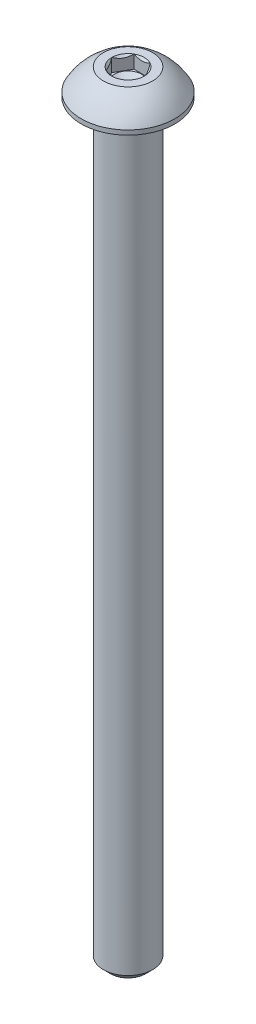
ISO-10303-21;
HEADER;
FILE_DESCRIPTION(('STEP AP214'),'2;1');
FILE_NAME('part.step','',(''),(''),'','','');
FILE_SCHEMA(('AUTOMOTIVE_DESIGN { 1 0 10303 214 1 1 1 1 }'));
ENDSEC;
DATA;
#1=APPLICATION_CONTEXT('core data for automotive mechanical design processes');
#2=APPLICATION_PROTOCOL_DEFINITION('international standard','automotive_design',2000,#1);
#3=PRODUCT_CONTEXT('',#1,'mechanical');
#4=PRODUCT('Part','Part','',(#3));
#5=PRODUCT_RELATED_PRODUCT_CATEGORY('part','',(#4));
#6=PRODUCT_DEFINITION_FORMATION('','',#4);
#7=PRODUCT_DEFINITION_CONTEXT('part definition',#1,'design');
#8=PRODUCT_DEFINITION('design','',#6,#7);
#9=PRODUCT_DEFINITION_SHAPE('','',#8);
#10=(LENGTH_UNIT() NAMED_UNIT(*) SI_UNIT(.MILLI.,.METRE.));
#11=(NAMED_UNIT(*) PLANE_ANGLE_UNIT() SI_UNIT($,.RADIAN.));
#12=(NAMED_UNIT(*) SI_UNIT($,.STERADIAN.) SOLID_ANGLE_UNIT());
#13=UNCERTAINTY_MEASURE_WITH_UNIT(LENGTH_MEASURE(1.E-05),#10,'distance_accuracy_value','');
#14=(GEOMETRIC_REPRESENTATION_CONTEXT(3) GLOBAL_UNCERTAINTY_ASSIGNED_CONTEXT((#13)) GLOBAL_UNIT_ASSIGNED_CONTEXT((#10,
#11,#12)) REPRESENTATION_CONTEXT('',''));
#15=CARTESIAN_POINT('',(0.,0.,0.));
#16=DIRECTION('',(0.,0.,1.));
#17=DIRECTION('',(1.,0.,0.));
#18=AXIS2_PLACEMENT_3D('',#15,#16,#17);
#19=CARTESIAN_POINT('',(0.,0.,0.));
#20=DIRECTION('',(0.,1.,0.));
#21=DIRECTION('',(0.,0.,1.));
#22=AXIS2_PLACEMENT_3D('',#19,#20,#21);
#23=PLANE('',#22);
#24=CARTESIAN_POINT('',(0.,0.,0.));
#25=DIRECTION('',(0.,-1.,0.));
#26=DIRECTION('',(-1.,0.,0.));
#27=AXIS2_PLACEMENT_3D('',#24,#25,#26);
#28=CIRCLE('',#27,1.4859);
#29=CARTESIAN_POINT('',(-1.4859,0.,0.));
#30=VERTEX_POINT('',#29);
#31=EDGE_CURVE('E184',#30,#30,#28,.T.);
#32=ORIENTED_EDGE('',*,*,#31,.T.);
#33=EDGE_LOOP('',(#32));
#34=FACE_BOUND('',#33,.T.);
#35=ADVANCED_FACE('F16',(#34),#23,.F.);
#36=CARTESIAN_POINT('',(0.,0.,0.));
#37=DIRECTION('',(0.,-1.,0.));
#38=DIRECTION('',(-1.,0.,0.));
#39=AXIS2_PLACEMENT_3D('',#36,#37,#38);
#40=CYLINDRICAL_SURFACE('',#39,2.0828);
#41=CARTESIAN_POINT('',(0.,63.5,0.));
#42=DIRECTION('',(0.,1.,0.));
#43=DIRECTION('',(-1.,0.,0.));
#44=AXIS2_PLACEMENT_3D('',#41,#42,#43);
#45=CIRCLE('',#44,2.0828);
#46=CARTESIAN_POINT('',(-2.0828,63.5,0.));
#47=VERTEX_POINT('',#46);
#48=EDGE_CURVE('E176',#47,#47,#45,.T.);
#49=ORIENTED_EDGE('',*,*,#48,.F.);
#50=EDGE_LOOP('',(#49));
#51=FACE_BOUND('',#50,.T.);
#52=CARTESIAN_POINT('',(0.,0.5969,0.));
#53=DIRECTION('',(0.,1.,0.));
#54=DIRECTION('',(-1.,0.,0.));
#55=AXIS2_PLACEMENT_3D('',#52,#53,#54);
#56=CIRCLE('',#55,2.0828);
#57=CARTESIAN_POINT('',(2.0828,0.5969,0.));
#58=VERTEX_POINT('',#57);
#59=EDGE_CURVE('E182',#58,#58,#56,.T.);
#60=ORIENTED_EDGE('',*,*,#59,.T.);
#61=EDGE_LOOP('',(#60));
#62=FACE_BOUND('',#61,.T.);
#63=ADVANCED_FACE('F509',(#51,#62),#40,.T.);
#64=CARTESIAN_POINT('',(0.,63.6905,0.));
#65=DIRECTION('',(0.,1.,0.));
#66=DIRECTION('',(0.,0.,-1.));
#67=AXIS2_PLACEMENT_3D('',#64,#65,#66);
#68=CYLINDRICAL_SURFACE('',#67,3.9624);
#69=CARTESIAN_POINT('',(0.,63.5,0.));
#70=DIRECTION('',(0.,-1.,0.));
#71=DIRECTION('',(1.,0.,0.));
#72=AXIS2_PLACEMENT_3D('',#69,#70,#71);
#73=CIRCLE('',#72,3.9624);
#74=CARTESIAN_POINT('',(0.,63.5,-3.9624));
#75=VERTEX_POINT('',#74);
#76=EDGE_CURVE('E96',#75,#75,#73,.T.);
#77=ORIENTED_EDGE('',*,*,#76,.F.);
#78=EDGE_LOOP('',(#77));
#79=FACE_BOUND('',#78,.T.);
#80=CARTESIAN_POINT('',(0.,63.881,0.));
#81=DIRECTION('',(0.,-1.,0.));
#82=DIRECTION('',(1.,0.,0.));
#83=AXIS2_PLACEMENT_3D('',#80,#81,#82);
#84=CIRCLE('',#83,3.9624);
#85=CARTESIAN_POINT('',(0.,63.881,-3.9624));
#86=VERTEX_POINT('',#85);
#87=EDGE_CURVE('E11',#86,#86,#84,.T.);
#88=ORIENTED_EDGE('',*,*,#87,.T.);
#89=EDGE_LOOP('',(#88));
#90=FACE_BOUND('',#89,.T.);
#91=ADVANCED_FACE('F319',(#79,#90),#68,.T.);
#92=CARTESIAN_POINT('',(0.,61.6888388888889,0.));
#93=DIRECTION('',(0.,0.,1.));
#94=DIRECTION('',(1.,0.,0.));
#95=AXIS2_PLACEMENT_3D('',#92,#93,#94);
#96=SPHERICAL_SURFACE('',#95,4.52837543685016);
#97=CARTESIAN_POINT('',(0.,61.6888388888889,0.));
#98=DIRECTION('',(0.,-1.,0.));
#99=DIRECTION('',(1.,0.,0.));
#100=AXIS2_PLACEMENT_3D('',#97,#98,#99);
#101=SPHERICAL_SURFACE('',#100,4.52837543685016);
#102=ORIENTED_EDGE('',*,*,#87,.F.);
#103=EDGE_LOOP('',(#102));
#104=FACE_BOUND('',#103,.T.);
#105=CARTESIAN_POINT('',(0.,65.7098,0.));
#106=DIRECTION('',(0.,-1.,0.));
#107=DIRECTION('',(1.,0.,0.));
#108=AXIS2_PLACEMENT_3D('',#105,#106,#107);
#109=CIRCLE('',#108,2.0828);
#110=CARTESIAN_POINT('',(0.,65.7098,-2.0828));
#111=VERTEX_POINT('',#110);
#112=EDGE_CURVE('E180',#111,#111,#109,.T.);
#113=ORIENTED_EDGE('',*,*,#112,.T.);
#114=EDGE_LOOP('',(#113));
#115=FACE_BOUND('',#114,.T.);
#116=ADVANCED_FACE('F312',(#104,#115),#101,.T.);
#117=CARTESIAN_POINT('',(0.,64.4271,0.));
#118=DIRECTION('',(0.,1.,0.));
#119=DIRECTION('',(0.,0.,-1.));
#120=AXIS2_PLACEMENT_3D('',#117,#118,#119);
#121=CONICAL_SURFACE('',#120,0.8763,1.03037682652431);
#122=CARTESIAN_POINT('',(0.,64.2366,0.));
#123=DIRECTION('',(0.,-1.,0.));
#124=DIRECTION('',(1.,0.,0.));
#125=AXIS2_PLACEMENT_3D('',#122,#123,#124);
#126=CIRCLE('',#125,0.5588);
#127=CARTESIAN_POINT('',(0.,64.2366,-0.5588));
#128=VERTEX_POINT('',#127);
#129=EDGE_CURVE('E26',#128,#128,#126,.T.);
#130=ORIENTED_EDGE('',*,*,#129,.T.);
#131=EDGE_LOOP('',(#130));
#132=FACE_BOUND('',#131,.T.);
#133=CARTESIAN_POINT('',(0.,64.5922,0.));
#134=DIRECTION('',(0.,1.,0.));
#135=DIRECTION('',(0.,0.,-1.));
#136=AXIS2_PLACEMENT_3D('',#133,#134,#135);
#137=CIRCLE('',#136,1.15146666666666);
#138=CARTESIAN_POINT('',(0.,64.5922,1.15146666666666));
#139=VERTEX_POINT('',#138);
#140=EDGE_CURVE('E103',#139,#139,#137,.T.);
#141=ORIENTED_EDGE('',*,*,#140,.T.);
#142=EDGE_LOOP('',(#141));
#143=FACE_BOUND('',#142,.T.);
#144=ADVANCED_FACE('F318',(#132,#143),#121,.F.);
#145=CARTESIAN_POINT('',(0.,64.2366,-0.5588));
#146=DIRECTION('',(0.,1.,0.));
#147=DIRECTION('',(0.,0.,1.));
#148=AXIS2_PLACEMENT_3D('',#145,#146,#147);
#149=PLANE('',#148);
#150=ORIENTED_EDGE('',*,*,#129,.F.);
#151=EDGE_LOOP('',(#150));
#152=FACE_BOUND('',#151,.T.);
#153=ADVANCED_FACE('F373',(#152),#149,.T.);
#154=CARTESIAN_POINT('',(0.,63.5,0.));
#155=DIRECTION('',(0.,-1.,0.));
#156=DIRECTION('',(0.,0.,-1.));
#157=AXIS2_PLACEMENT_3D('',#154,#155,#156);
#158=PLANE('',#157);
#159=ORIENTED_EDGE('',*,*,#48,.T.);
#160=EDGE_LOOP('',(#159));
#161=FACE_BOUND('',#160,.T.);
#162=ORIENTED_EDGE('',*,*,#76,.T.);
#163=EDGE_LOOP('',(#162));
#164=FACE_BOUND('',#163,.T.);
#165=ADVANCED_FACE('F368',(#161,#164),#158,.T.);
#166=CARTESIAN_POINT('',(0.,64.5922,0.));
#167=DIRECTION('',(0.,-1.,0.));
#168=DIRECTION('',(0.,0.,-1.));
#169=AXIS2_PLACEMENT_3D('',#166,#167,#168);
#170=PLANE('',#169);
#171=DIRECTION('',(0.5,0.,-0.866025403784439));
#172=VECTOR('',#171,1.);
#173=CARTESIAN_POINT('',(-0.689240751358575,64.5922,-1.1938));
#174=LINE('',#173,#172);
#175=CARTESIAN_POINT('',(-1.37848150271715,64.5922,0.));
#176=VERTEX_POINT('',#175);
#177=CARTESIAN_POINT('',(-0.689240751358575,64.5922,-1.1938));
#178=VERTEX_POINT('',#177);
#179=EDGE_CURVE('E125',#176,#178,#174,.T.);
#180=ORIENTED_EDGE('',*,*,#179,.F.);
#181=DIRECTION('',(-0.5,0.,-0.866025403784439));
#182=VECTOR('',#181,1.);
#183=CARTESIAN_POINT('',(-1.37848150271715,64.5922,0.));
#184=LINE('',#183,#182);
#185=CARTESIAN_POINT('',(-0.689240751358576,64.5922,1.1938));
#186=VERTEX_POINT('',#185);
#187=EDGE_CURVE('E214',#186,#176,#184,.T.);
#188=ORIENTED_EDGE('',*,*,#187,.F.);
#189=DIRECTION('',(-1.,0.,0.));
#190=VECTOR('',#189,1.);
#191=CARTESIAN_POINT('',(-0.689240751358576,64.5922,1.1938));
#192=LINE('',#191,#190);
#193=CARTESIAN_POINT('',(0.689240751358575,64.5922,1.1938));
#194=VERTEX_POINT('',#193);
#195=EDGE_CURVE('E148',#194,#186,#192,.T.);
#196=ORIENTED_EDGE('',*,*,#195,.F.);
#197=DIRECTION('',(-0.5,0.,0.866025403784438));
#198=VECTOR('',#197,1.);
#199=CARTESIAN_POINT('',(0.689240751358574,64.5922,1.1938));
#200=LINE('',#199,#198);
#201=CARTESIAN_POINT('',(1.37848150271715,64.5922,0.));
#202=VERTEX_POINT('',#201);
#203=EDGE_CURVE('E131',#202,#194,#200,.T.);
#204=ORIENTED_EDGE('',*,*,#203,.F.);
#205=DIRECTION('',(0.5,0.,0.866025403784439));
#206=VECTOR('',#205,1.);
#207=CARTESIAN_POINT('',(1.37848150271715,64.5922,0.));
#208=LINE('',#207,#206);
#209=CARTESIAN_POINT('',(0.689240751358575,64.5922,-1.1938));
#210=VERTEX_POINT('',#209);
#211=EDGE_CURVE('E146',#210,#202,#208,.T.);
#212=ORIENTED_EDGE('',*,*,#211,.F.);
#213=DIRECTION('',(1.,0.,0.));
#214=VECTOR('',#213,1.);
#215=CARTESIAN_POINT('',(0.689240751358575,64.5922,-1.1938));
#216=LINE('',#215,#214);
#217=EDGE_CURVE('E257',#178,#210,#216,.T.);
#218=ORIENTED_EDGE('',*,*,#217,.F.);
#219=EDGE_LOOP('',(#180,#188,#196,#204,#212,#218));
#220=FACE_BOUND('',#219,.T.);
#221=ORIENTED_EDGE('',*,*,#140,.F.);
#222=EDGE_LOOP('',(#221));
#223=FACE_BOUND('',#222,.T.);
#224=ADVANCED_FACE('F300',(#220,#223),#170,.F.);
#225=CARTESIAN_POINT('',(-1.37848150271715,65.7098,0.));
#226=DIRECTION('',(-0.866025403784439,0.,-0.5));
#227=DIRECTION('',(0.5,0.,-0.866025403784439));
#228=AXIS2_PLACEMENT_3D('',#225,#226,#227);
#229=PLANE('',#228);
#230=CARTESIAN_POINT('',(-0.696174837710029,65.7098,-1.18178981013521));
#231=CARTESIAN_POINT('',(-1.03386112703786,65.3772481481482,-0.596899999999999));
#232=CARTESIAN_POINT('',(-1.37154741636569,65.7098,-0.0120101898647895));
#233=(BOUNDED_CURVE() B_SPLINE_CURVE(2,(#230,#231,#232),.UNSPECIFIED.,.F.,
.F.) B_SPLINE_CURVE_WITH_KNOTS((3,3),(0.,0.139676907182254),
.UNSPECIFIED.) CURVE() GEOMETRIC_REPRESENTATION_ITEM() RATIONAL_B_SPLINE_CURVE((1.,
1.1489361702128,1.)) REPRESENTATION_ITEM(''));
#234=CARTESIAN_POINT('',(-0.696174837710028,65.7098,-1.18178981013521));
#235=VERTEX_POINT('',#234);
#236=CARTESIAN_POINT('',(-1.37154741636569,65.7098,-0.0120101898647889));
#237=VERTEX_POINT('',#236);
#238=EDGE_CURVE('E195',#235,#237,#233,.T.);
#239=ORIENTED_EDGE('',*,*,#238,.T.);
#240=DIRECTION('',(0.5,0.,-0.866025403784439));
#241=VECTOR('',#240,1.);
#242=CARTESIAN_POINT('',(-0.755231887126948,65.7098,-1.0795));
#243=LINE('',#242,#241);
#244=CARTESIAN_POINT('',(-1.37848150271715,65.7098,0.));
#245=VERTEX_POINT('',#244);
#246=EDGE_CURVE('E193',#245,#237,#243,.T.);
#247=ORIENTED_EDGE('',*,*,#246,.F.);
#248=DIRECTION('',(0.,-1.,0.));
#249=VECTOR('',#248,1.);
#250=CARTESIAN_POINT('',(-1.37848150271715,65.7098,0.));
#251=LINE('',#250,#249);
#252=EDGE_CURVE('E211',#245,#176,#251,.T.);
#253=ORIENTED_EDGE('',*,*,#252,.T.);
#254=ORIENTED_EDGE('',*,*,#179,.T.);
#255=DIRECTION('',(0.,-1.,0.));
#256=VECTOR('',#255,1.);
#257=CARTESIAN_POINT('',(-0.689240751358575,65.7098,-1.1938));
#258=LINE('',#257,#256);
#259=CARTESIAN_POINT('',(-0.689240751358575,65.7098,-1.1938));
#260=VERTEX_POINT('',#259);
#261=EDGE_CURVE('E235',#260,#178,#258,.T.);
#262=ORIENTED_EDGE('',*,*,#261,.F.);
#263=DIRECTION('',(0.5,0.,-0.866025403784439));
#264=VECTOR('',#263,1.);
#265=CARTESIAN_POINT('',(-0.755231887126948,65.7098,-1.0795));
#266=LINE('',#265,#264);
#267=EDGE_CURVE('E175',#235,#260,#266,.T.);
#268=ORIENTED_EDGE('',*,*,#267,.F.);
#269=EDGE_LOOP('',(#239,#247,#253,#254,#262,#268));
#270=FACE_BOUND('',#269,.T.);
#271=ADVANCED_FACE('F360',(#270),#229,.F.);
#272=CARTESIAN_POINT('',(-0.689240751358575,65.7098,-1.1938));
#273=DIRECTION('',(0.,0.,-1.));
#274=DIRECTION('',(1.,0.,0.));
#275=AXIS2_PLACEMENT_3D('',#272,#273,#274);
#276=PLANE('',#275);
#277=CARTESIAN_POINT('',(0.67537257865567,65.7098,-1.1938));
#278=CARTESIAN_POINT('',(0.,65.3772481481481,-1.1938));
#279=CARTESIAN_POINT('',(-0.675372578655669,65.7098,-1.1938));
#280=(BOUNDED_CURVE() B_SPLINE_CURVE(2,(#277,#278,#279),.UNSPECIFIED.,.F.,
.F.) B_SPLINE_CURVE_WITH_KNOTS((3,3),(0.,0.139676907182255),
.UNSPECIFIED.) CURVE() GEOMETRIC_REPRESENTATION_ITEM() RATIONAL_B_SPLINE_CURVE((1.,
1.14893617021273,1.)) REPRESENTATION_ITEM(''));
#281=CARTESIAN_POINT('',(0.675372578655669,65.7098,-1.1938));
#282=VERTEX_POINT('',#281);
#283=CARTESIAN_POINT('',(-0.675372578655669,65.7098,-1.1938));
#284=VERTEX_POINT('',#283);
#285=EDGE_CURVE('E210',#282,#284,#280,.T.);
#286=ORIENTED_EDGE('',*,*,#285,.T.);
#287=DIRECTION('',(1.,0.,0.));
#288=VECTOR('',#287,1.);
#289=CARTESIAN_POINT('',(-0.344620375679287,65.7098,-1.1938));
#290=LINE('',#289,#288);
#291=EDGE_CURVE('E173',#260,#284,#290,.T.);
#292=ORIENTED_EDGE('',*,*,#291,.F.);
#293=ORIENTED_EDGE('',*,*,#261,.T.);
#294=ORIENTED_EDGE('',*,*,#217,.T.);
#295=DIRECTION('',(0.,-1.,0.));
#296=VECTOR('',#295,1.);
#297=CARTESIAN_POINT('',(0.689240751358575,65.7098,-1.1938));
#298=LINE('',#297,#296);
#299=CARTESIAN_POINT('',(0.689240751358575,65.7098,-1.1938));
#300=VERTEX_POINT('',#299);
#301=EDGE_CURVE('E230',#300,#210,#298,.T.);
#302=ORIENTED_EDGE('',*,*,#301,.F.);
#303=DIRECTION('',(1.,0.,0.));
#304=VECTOR('',#303,1.);
#305=CARTESIAN_POINT('',(-0.344620375679287,65.7098,-1.1938));
#306=LINE('',#305,#304);
#307=EDGE_CURVE('E168',#282,#300,#306,.T.);
#308=ORIENTED_EDGE('',*,*,#307,.F.);
#309=EDGE_LOOP('',(#286,#292,#293,#294,#302,#308));
#310=FACE_BOUND('',#309,.T.);
#311=ADVANCED_FACE('F349',(#310),#276,.F.);
#312=CARTESIAN_POINT('',(0.689240751358575,65.7098,-1.1938));
#313=DIRECTION('',(0.866025403784439,0.,-0.5));
#314=DIRECTION('',(0.5,0.,0.866025403784439));
#315=AXIS2_PLACEMENT_3D('',#312,#313,#314);
#316=PLANE('',#315);
#317=CARTESIAN_POINT('',(1.37154741636569,65.7098,-0.012010189864788));
#318=CARTESIAN_POINT('',(1.03386112703786,65.3772481481482,-0.596899999999999));
#319=CARTESIAN_POINT('',(0.696174837710029,65.7098,-1.18178981013521));
#320=(BOUNDED_CURVE() B_SPLINE_CURVE(2,(#317,#318,#319),.UNSPECIFIED.,.F.,
.F.) B_SPLINE_CURVE_WITH_KNOTS((3,3),(0.,0.139676907182255),
.UNSPECIFIED.) CURVE() GEOMETRIC_REPRESENTATION_ITEM() RATIONAL_B_SPLINE_CURVE((1.,
1.1489361702128,1.)) REPRESENTATION_ITEM(''));
#321=CARTESIAN_POINT('',(1.37154741636569,65.7098,-0.0120101898647873));
#322=VERTEX_POINT('',#321);
#323=CARTESIAN_POINT('',(0.696174837710029,65.7098,-1.18178981013521));
#324=VERTEX_POINT('',#323);
#325=EDGE_CURVE('E209',#322,#324,#320,.T.);
#326=ORIENTED_EDGE('',*,*,#325,.T.);
#327=DIRECTION('',(0.5,0.,0.866025403784439));
#328=VECTOR('',#327,1.);
#329=CARTESIAN_POINT('',(0.410611511447661,65.7098,-1.6764));
#330=LINE('',#329,#328);
#331=EDGE_CURVE('E166',#300,#324,#330,.T.);
#332=ORIENTED_EDGE('',*,*,#331,.F.);
#333=ORIENTED_EDGE('',*,*,#301,.T.);
#334=ORIENTED_EDGE('',*,*,#211,.T.);
#335=DIRECTION('',(0.,-1.,0.));
#336=VECTOR('',#335,1.);
#337=CARTESIAN_POINT('',(1.37848150271715,65.7098,0.));
#338=LINE('',#337,#336);
#339=CARTESIAN_POINT('',(1.37848150271715,65.7098,0.));
#340=VERTEX_POINT('',#339);
#341=EDGE_CURVE('E137',#340,#202,#338,.T.);
#342=ORIENTED_EDGE('',*,*,#341,.F.);
#343=DIRECTION('',(0.5,0.,0.866025403784439));
#344=VECTOR('',#343,1.);
#345=CARTESIAN_POINT('',(0.410611511447661,65.7098,-1.6764));
#346=LINE('',#345,#344);
#347=EDGE_CURVE('E142',#322,#340,#346,.T.);
#348=ORIENTED_EDGE('',*,*,#347,.F.);
#349=EDGE_LOOP('',(#326,#332,#333,#334,#342,#348));
#350=FACE_BOUND('',#349,.T.);
#351=ADVANCED_FACE('F140',(#350),#316,.F.);
#352=CARTESIAN_POINT('',(1.37848150271715,65.7098,0.));
#353=DIRECTION('',(0.866025403784438,0.,0.5));
#354=DIRECTION('',(-0.5,0.,0.866025403784438));
#355=AXIS2_PLACEMENT_3D('',#352,#353,#354);
#356=PLANE('',#355);
#357=CARTESIAN_POINT('',(0.696174837710034,65.7098,1.18178981013521));
#358=CARTESIAN_POINT('',(1.03386112703786,65.3772481481482,0.596900000000002));
#359=CARTESIAN_POINT('',(1.37154741636569,65.7098,0.0120101898647967));
#360=(BOUNDED_CURVE() B_SPLINE_CURVE(2,(#357,#358,#359),.UNSPECIFIED.,.F.,
.F.) B_SPLINE_CURVE_WITH_KNOTS((3,3),(0.,0.139676907182253),
.UNSPECIFIED.) CURVE() GEOMETRIC_REPRESENTATION_ITEM() RATIONAL_B_SPLINE_CURVE((1.,
1.1489361702128,1.)) REPRESENTATION_ITEM(''));
#361=CARTESIAN_POINT('',(0.696174837710034,65.7098,1.18178981013521));
#362=VERTEX_POINT('',#361);
#363=CARTESIAN_POINT('',(1.37154741636569,65.7098,0.0120101898647965));
#364=VERTEX_POINT('',#363);
#365=EDGE_CURVE('E154',#362,#364,#360,.T.);
#366=ORIENTED_EDGE('',*,*,#365,.T.);
#367=DIRECTION('',(-0.5,0.,0.866025403784438));
#368=VECTOR('',#367,1.);
#369=CARTESIAN_POINT('',(1.65711074262806,65.7098,-0.4826));
#370=LINE('',#369,#368);
#371=EDGE_CURVE('E151',#340,#364,#370,.T.);
#372=ORIENTED_EDGE('',*,*,#371,.F.);
#373=ORIENTED_EDGE('',*,*,#341,.T.);
#374=ORIENTED_EDGE('',*,*,#203,.T.);
#375=DIRECTION('',(0.,-1.,0.));
#376=VECTOR('',#375,1.);
#377=CARTESIAN_POINT('',(0.689240751358574,65.7098,1.1938));
#378=LINE('',#377,#376);
#379=CARTESIAN_POINT('',(0.689240751358574,65.7098,1.1938));
#380=VERTEX_POINT('',#379);
#381=EDGE_CURVE('E19',#380,#194,#378,.T.);
#382=ORIENTED_EDGE('',*,*,#381,.F.);
#383=DIRECTION('',(-0.5,0.,0.866025403784438));
#384=VECTOR('',#383,1.);
#385=CARTESIAN_POINT('',(1.65711074262806,65.7098,-0.4826));
#386=LINE('',#385,#384);
#387=EDGE_CURVE('E158',#362,#380,#386,.T.);
#388=ORIENTED_EDGE('',*,*,#387,.F.);
#389=EDGE_LOOP('',(#366,#372,#373,#374,#382,#388));
#390=FACE_BOUND('',#389,.T.);
#391=ADVANCED_FACE('F152',(#390),#356,.F.);
#392=CARTESIAN_POINT('',(0.689240751358574,65.7098,1.1938));
#393=DIRECTION('',(0.,0.,1.));
#394=DIRECTION('',(-1.,0.,0.));
#395=AXIS2_PLACEMENT_3D('',#392,#393,#394);
#396=PLANE('',#395);
#397=CARTESIAN_POINT('',(-0.675372578655658,65.7098,1.1938));
#398=CARTESIAN_POINT('',(0.,65.3772481481482,1.1938));
#399=CARTESIAN_POINT('',(0.675372578655657,65.7098,1.1938));
#400=(BOUNDED_CURVE() B_SPLINE_CURVE(2,(#397,#398,#399),.UNSPECIFIED.,.F.,
.F.) B_SPLINE_CURVE_WITH_KNOTS((3,3),(0.,0.139676907182252),
.UNSPECIFIED.) CURVE() GEOMETRIC_REPRESENTATION_ITEM() RATIONAL_B_SPLINE_CURVE((1.,
1.14893617021267,1.)) REPRESENTATION_ITEM(''));
#401=CARTESIAN_POINT('',(-0.675372578655658,65.7098,1.1938));
#402=VERTEX_POINT('',#401);
#403=CARTESIAN_POINT('',(0.675372578655657,65.7098,1.1938));
#404=VERTEX_POINT('',#403);
#405=EDGE_CURVE('E188',#402,#404,#400,.T.);
#406=ORIENTED_EDGE('',*,*,#405,.T.);
#407=DIRECTION('',(-1.,0.,0.));
#408=VECTOR('',#407,1.);
#409=CARTESIAN_POINT('',(0.344620375679286,65.7098,1.1938));
#410=LINE('',#409,#408);
#411=EDGE_CURVE('E200',#380,#404,#410,.T.);
#412=ORIENTED_EDGE('',*,*,#411,.F.);
#413=ORIENTED_EDGE('',*,*,#381,.T.);
#414=ORIENTED_EDGE('',*,*,#195,.T.);
#415=DIRECTION('',(0.,-1.,0.));
#416=VECTOR('',#415,1.);
#417=CARTESIAN_POINT('',(-0.689240751358576,65.7098,1.1938));
#418=LINE('',#417,#416);
#419=CARTESIAN_POINT('',(-0.689240751358576,65.7098,1.1938));
#420=VERTEX_POINT('',#419);
#421=EDGE_CURVE('E171',#420,#186,#418,.T.);
#422=ORIENTED_EDGE('',*,*,#421,.F.);
#423=DIRECTION('',(-1.,0.,0.));
#424=VECTOR('',#423,1.);
#425=CARTESIAN_POINT('',(0.344620375679286,65.7098,1.1938));
#426=LINE('',#425,#424);
#427=EDGE_CURVE('E205',#402,#420,#426,.T.);
#428=ORIENTED_EDGE('',*,*,#427,.F.);
#429=EDGE_LOOP('',(#406,#412,#413,#414,#422,#428));
#430=FACE_BOUND('',#429,.T.);
#431=ADVANCED_FACE('F305',(#430),#396,.F.);
#432=CARTESIAN_POINT('',(-0.689240751358576,65.7098,1.1938));
#433=DIRECTION('',(-0.866025403784439,0.,0.5));
#434=DIRECTION('',(-0.5,0.,-0.866025403784439));
#435=AXIS2_PLACEMENT_3D('',#432,#433,#434);
#436=PLANE('',#435);
#437=CARTESIAN_POINT('',(-1.37154741636569,65.7098,0.0120101898647947));
#438=CARTESIAN_POINT('',(-1.03386112703786,65.3772481481482,0.5969));
#439=CARTESIAN_POINT('',(-0.696174837710035,65.7098,1.18178981013521));
#440=(BOUNDED_CURVE() B_SPLINE_CURVE(2,(#437,#438,#439),.UNSPECIFIED.,.F.,
.F.) B_SPLINE_CURVE_WITH_KNOTS((3,3),(0.,0.139676907182253),
.UNSPECIFIED.) CURVE() GEOMETRIC_REPRESENTATION_ITEM() RATIONAL_B_SPLINE_CURVE((1.,
1.1489361702128,1.)) REPRESENTATION_ITEM(''));
#441=CARTESIAN_POINT('',(-1.37154741636569,65.7098,0.0120101898647945));
#442=VERTEX_POINT('',#441);
#443=CARTESIAN_POINT('',(-0.696174837710035,65.7098,1.18178981013521));
#444=VERTEX_POINT('',#443);
#445=EDGE_CURVE('E181',#442,#444,#440,.T.);
#446=ORIENTED_EDGE('',*,*,#445,.T.);
#447=DIRECTION('',(-0.5,0.,-0.866025403784439));
#448=VECTOR('',#447,1.);
#449=CARTESIAN_POINT('',(-1.31249036694878,65.7098,0.114300000000001));
#450=LINE('',#449,#448);
#451=EDGE_CURVE('E248',#420,#444,#450,.T.);
#452=ORIENTED_EDGE('',*,*,#451,.F.);
#453=ORIENTED_EDGE('',*,*,#421,.T.);
#454=ORIENTED_EDGE('',*,*,#187,.T.);
#455=ORIENTED_EDGE('',*,*,#252,.F.);
#456=DIRECTION('',(-0.5,0.,-0.866025403784439));
#457=VECTOR('',#456,1.);
#458=CARTESIAN_POINT('',(-1.31249036694878,65.7098,0.114300000000001));
#459=LINE('',#458,#457);
#460=EDGE_CURVE('E227',#442,#245,#459,.T.);
#461=ORIENTED_EDGE('',*,*,#460,.F.);
#462=EDGE_LOOP('',(#446,#452,#453,#454,#455,#461));
#463=FACE_BOUND('',#462,.T.);
#464=ADVANCED_FACE('F297',(#463),#436,.F.);
#465=CARTESIAN_POINT('',(0.,65.7098,-2.0828));
#466=DIRECTION('',(0.,1.,0.));
#467=DIRECTION('',(0.,0.,1.));
#468=AXIS2_PLACEMENT_3D('',#465,#466,#467);
#469=PLANE('',#468);
#470=CARTESIAN_POINT('',(0.,65.7098,0.));
#471=DIRECTION('',(0.,-1.,0.));
#472=DIRECTION('',(-1.,0.,0.));
#473=AXIS2_PLACEMENT_3D('',#470,#471,#472);
#474=CIRCLE('',#473,1.3716);
#475=EDGE_CURVE('E178',#444,#442,#474,.T.);
#476=ORIENTED_EDGE('',*,*,#475,.T.);
#477=ORIENTED_EDGE('',*,*,#460,.T.);
#478=ORIENTED_EDGE('',*,*,#246,.T.);
#479=CARTESIAN_POINT('',(0.,65.7098,0.));
#480=DIRECTION('',(0.,-1.,0.));
#481=DIRECTION('',(-1.,0.,0.));
#482=AXIS2_PLACEMENT_3D('',#479,#480,#481);
#483=CIRCLE('',#482,1.3716);
#484=EDGE_CURVE('E219',#237,#235,#483,.T.);
#485=ORIENTED_EDGE('',*,*,#484,.T.);
#486=ORIENTED_EDGE('',*,*,#267,.T.);
#487=ORIENTED_EDGE('',*,*,#291,.T.);
#488=CARTESIAN_POINT('',(0.,65.7098,0.));
#489=DIRECTION('',(0.,-1.,0.));
#490=DIRECTION('',(-1.,0.,0.));
#491=AXIS2_PLACEMENT_3D('',#488,#489,#490);
#492=CIRCLE('',#491,1.3716);
#493=EDGE_CURVE('E206',#284,#282,#492,.T.);
#494=ORIENTED_EDGE('',*,*,#493,.T.);
#495=ORIENTED_EDGE('',*,*,#307,.T.);
#496=ORIENTED_EDGE('',*,*,#331,.T.);
#497=CARTESIAN_POINT('',(0.,65.7098,0.));
#498=DIRECTION('',(0.,-1.,0.));
#499=DIRECTION('',(-1.,0.,0.));
#500=AXIS2_PLACEMENT_3D('',#497,#498,#499);
#501=CIRCLE('',#500,1.3716);
#502=EDGE_CURVE('E164',#324,#322,#501,.T.);
#503=ORIENTED_EDGE('',*,*,#502,.T.);
#504=ORIENTED_EDGE('',*,*,#347,.T.);
#505=ORIENTED_EDGE('',*,*,#371,.T.);
#506=CARTESIAN_POINT('',(0.,65.7098,0.));
#507=DIRECTION('',(0.,-1.,0.));
#508=DIRECTION('',(-1.,0.,0.));
#509=AXIS2_PLACEMENT_3D('',#506,#507,#508);
#510=CIRCLE('',#509,1.3716);
#511=EDGE_CURVE('E236',#364,#362,#510,.T.);
#512=ORIENTED_EDGE('',*,*,#511,.T.);
#513=ORIENTED_EDGE('',*,*,#387,.T.);
#514=ORIENTED_EDGE('',*,*,#411,.T.);
#515=CARTESIAN_POINT('',(0.,65.7098,0.));
#516=DIRECTION('',(0.,-1.,0.));
#517=DIRECTION('',(-1.,0.,0.));
#518=AXIS2_PLACEMENT_3D('',#515,#516,#517);
#519=CIRCLE('',#518,1.3716);
#520=EDGE_CURVE('E185',#404,#402,#519,.T.);
#521=ORIENTED_EDGE('',*,*,#520,.T.);
#522=ORIENTED_EDGE('',*,*,#427,.T.);
#523=ORIENTED_EDGE('',*,*,#451,.T.);
#524=EDGE_LOOP('',(#476,#477,#478,#485,#486,#487,#494,#495,#496,#503,#504,#505,#512,#513,#514,
#521,#522,#523));
#525=FACE_BOUND('',#524,.T.);
#526=ORIENTED_EDGE('',*,*,#112,.F.);
#527=EDGE_LOOP('',(#526));
#528=FACE_BOUND('',#527,.T.);
#529=ADVANCED_FACE('F161',(#525,#528),#469,.T.);
#530=CARTESIAN_POINT('',(0.,65.151,0.));
#531=DIRECTION('',(0.,1.,0.));
#532=DIRECTION('',(-1.,0.,0.));
#533=AXIS2_PLACEMENT_3D('',#530,#531,#532);
#534=CONICAL_SURFACE('',#533,0.8128,0.785398163397448);
#535=ORIENTED_EDGE('',*,*,#445,.F.);
#536=ORIENTED_EDGE('',*,*,#475,.F.);
#537=EDGE_LOOP('',(#535,#536));
#538=FACE_BOUND('',#537,.T.);
#539=ADVANCED_FACE('F396',(#538),#534,.F.);
#540=CARTESIAN_POINT('',(0.,65.151,0.));
#541=DIRECTION('',(0.,1.,0.));
#542=DIRECTION('',(-1.,0.,0.));
#543=AXIS2_PLACEMENT_3D('',#540,#541,#542);
#544=CONICAL_SURFACE('',#543,0.8128,0.785398163397448);
#545=ORIENTED_EDGE('',*,*,#405,.F.);
#546=ORIENTED_EDGE('',*,*,#520,.F.);
#547=EDGE_LOOP('',(#545,#546));
#548=FACE_BOUND('',#547,.T.);
#549=ADVANCED_FACE('F391',(#548),#544,.F.);
#550=CARTESIAN_POINT('',(0.,65.151,0.));
#551=DIRECTION('',(0.,1.,0.));
#552=DIRECTION('',(-1.,0.,0.));
#553=AXIS2_PLACEMENT_3D('',#550,#551,#552);
#554=CONICAL_SURFACE('',#553,0.8128,0.785398163397448);
#555=ORIENTED_EDGE('',*,*,#365,.F.);
#556=ORIENTED_EDGE('',*,*,#511,.F.);
#557=EDGE_LOOP('',(#555,#556));
#558=FACE_BOUND('',#557,.T.);
#559=ADVANCED_FACE('F336',(#558),#554,.F.);
#560=CARTESIAN_POINT('',(0.,65.151,0.));
#561=DIRECTION('',(0.,1.,0.));
#562=DIRECTION('',(-1.,0.,0.));
#563=AXIS2_PLACEMENT_3D('',#560,#561,#562);
#564=CONICAL_SURFACE('',#563,0.8128,0.785398163397448);
#565=ORIENTED_EDGE('',*,*,#325,.F.);
#566=ORIENTED_EDGE('',*,*,#502,.F.);
#567=EDGE_LOOP('',(#565,#566));
#568=FACE_BOUND('',#567,.T.);
#569=ADVANCED_FACE('F330',(#568),#564,.F.);
#570=CARTESIAN_POINT('',(0.,65.151,0.));
#571=DIRECTION('',(0.,1.,0.));
#572=DIRECTION('',(-1.,0.,0.));
#573=AXIS2_PLACEMENT_3D('',#570,#571,#572);
#574=CONICAL_SURFACE('',#573,0.8128,0.785398163397448);
#575=ORIENTED_EDGE('',*,*,#285,.F.);
#576=ORIENTED_EDGE('',*,*,#493,.F.);
#577=EDGE_LOOP('',(#575,#576));
#578=FACE_BOUND('',#577,.T.);
#579=ADVANCED_FACE('F335',(#578),#574,.F.);
#580=CARTESIAN_POINT('',(0.,65.151,0.));
#581=DIRECTION('',(0.,1.,0.));
#582=DIRECTION('',(-1.,0.,0.));
#583=AXIS2_PLACEMENT_3D('',#580,#581,#582);
#584=CONICAL_SURFACE('',#583,0.8128,0.785398163397448);
#585=ORIENTED_EDGE('',*,*,#238,.F.);
#586=ORIENTED_EDGE('',*,*,#484,.F.);
#587=EDGE_LOOP('',(#585,#586));
#588=FACE_BOUND('',#587,.T.);
#589=ADVANCED_FACE('F407',(#588),#584,.F.);
#590=CARTESIAN_POINT('',(0.,0.504431527502194,0.));
#591=DIRECTION('',(0.,1.,0.));
#592=DIRECTION('',(-1.,0.,0.));
#593=AXIS2_PLACEMENT_3D('',#590,#591,#592);
#594=CONICAL_SURFACE('',#593,1.9903315275022,0.785398163397449);
#595=ORIENTED_EDGE('',*,*,#31,.F.);
#596=EDGE_LOOP('',(#595));
#597=FACE_BOUND('',#596,.T.);
#598=ORIENTED_EDGE('',*,*,#59,.F.);
#599=EDGE_LOOP('',(#598));
#600=FACE_BOUND('',#599,.T.);
#601=ADVANCED_FACE('F425',(#597,#600),#594,.T.);
#602=CLOSED_SHELL('',(#35,#63,#91,#116,#144,#153,#165,#224,#271,#311,#351,#391,#431,#464,#529,
#539,#549,#559,#569,#579,#589,#601));
#603=MANIFOLD_SOLID_BREP('B1',#602);
#604=ADVANCED_BREP_SHAPE_REPRESENTATION('',(#18,#603),#14);
#605=SHAPE_DEFINITION_REPRESENTATION(#9,#604);
ENDSEC;
END-ISO-10303-21;
